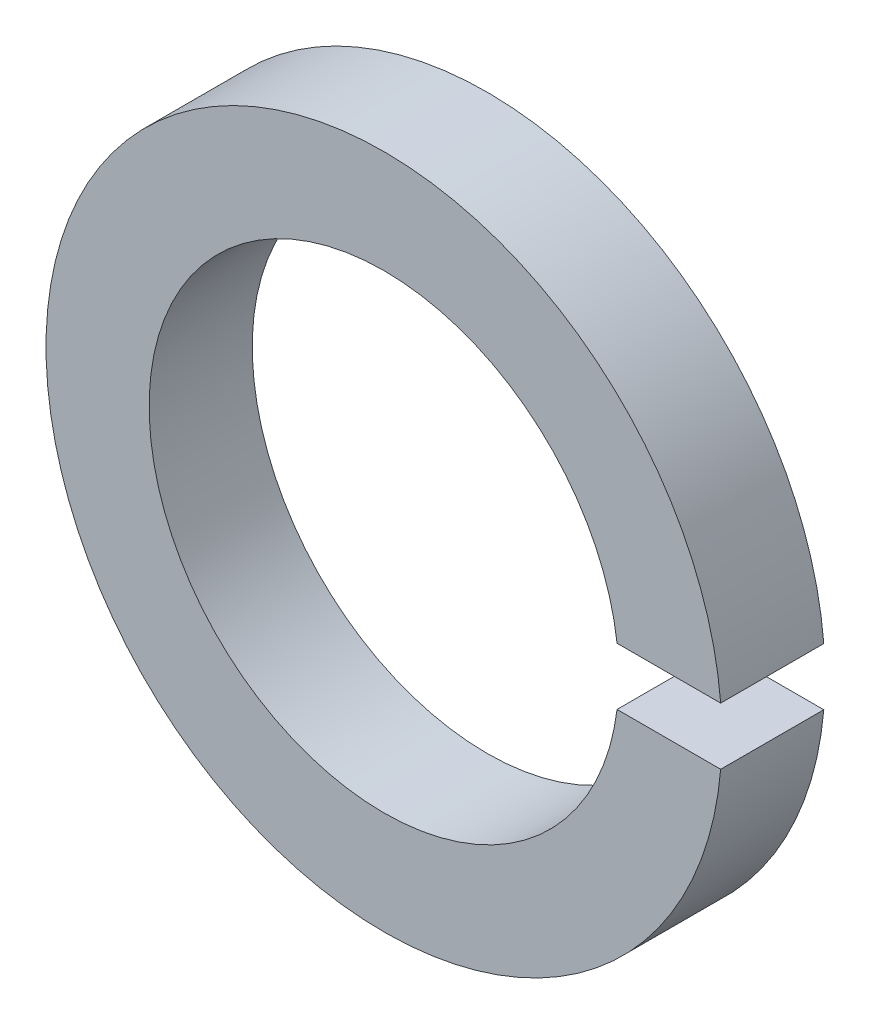
ISO-10303-21;
HEADER;
FILE_DESCRIPTION(('STEP AP214'),'2;1');
FILE_NAME('part.step','',(''),(''),'','','');
FILE_SCHEMA(('AUTOMOTIVE_DESIGN { 1 0 10303 214 1 1 1 1 }'));
ENDSEC;
DATA;
#1=APPLICATION_CONTEXT('core data for automotive mechanical design processes');
#2=APPLICATION_PROTOCOL_DEFINITION('international standard','automotive_design',2000,#1);
#3=PRODUCT_CONTEXT('',#1,'mechanical');
#4=PRODUCT('Part','Part','',(#3));
#5=PRODUCT_RELATED_PRODUCT_CATEGORY('part','',(#4));
#6=PRODUCT_DEFINITION_FORMATION('','',#4);
#7=PRODUCT_DEFINITION_CONTEXT('part definition',#1,'design');
#8=PRODUCT_DEFINITION('design','',#6,#7);
#9=PRODUCT_DEFINITION_SHAPE('','',#8);
#10=(LENGTH_UNIT() NAMED_UNIT(*) SI_UNIT(.MILLI.,.METRE.));
#11=(NAMED_UNIT(*) PLANE_ANGLE_UNIT() SI_UNIT($,.RADIAN.));
#12=(NAMED_UNIT(*) SI_UNIT($,.STERADIAN.) SOLID_ANGLE_UNIT());
#13=UNCERTAINTY_MEASURE_WITH_UNIT(LENGTH_MEASURE(1.E-05),#10,'distance_accuracy_value','');
#14=(GEOMETRIC_REPRESENTATION_CONTEXT(3) GLOBAL_UNCERTAINTY_ASSIGNED_CONTEXT((#13)) GLOBAL_UNIT_ASSIGNED_CONTEXT((#10,
#11,#12)) REPRESENTATION_CONTEXT('',''));
#15=CARTESIAN_POINT('',(0.,0.,0.));
#16=DIRECTION('',(0.,0.,1.));
#17=DIRECTION('',(1.,0.,0.));
#18=AXIS2_PLACEMENT_3D('',#15,#16,#17);
#19=CARTESIAN_POINT('',(0.,0.,4.5));
#20=DIRECTION('',(0.,0.,1.));
#21=DIRECTION('',(1.,0.,0.));
#22=AXIS2_PLACEMENT_3D('',#19,#20,#21);
#23=PLANE('',#22);
#24=DIRECTION('',(-1.,0.,0.));
#25=VECTOR('',#24,1.);
#26=CARTESIAN_POINT('',(0.,1.25,4.5));
#27=LINE('',#26,#25);
#28=CARTESIAN_POINT('',(14.6969384566991,1.25,4.5));
#29=VERTEX_POINT('',#28);
#30=CARTESIAN_POINT('',(10.1734949746879,1.25,4.5));
#31=VERTEX_POINT('',#30);
#32=EDGE_CURVE('E51',#29,#31,#27,.T.);
#33=ORIENTED_EDGE('',*,*,#32,.F.);
#34=CARTESIAN_POINT('',(0.,0.,4.5));
#35=DIRECTION('',(0.,0.,1.));
#36=DIRECTION('',(1.,0.,0.));
#37=AXIS2_PLACEMENT_3D('',#34,#35,#36);
#38=CIRCLE('',#37,14.75);
#39=CARTESIAN_POINT('',(14.6969384566991,-1.24999999999999,4.5));
#40=VERTEX_POINT('',#39);
#41=EDGE_CURVE('E74',#29,#40,#38,.T.);
#42=ORIENTED_EDGE('',*,*,#41,.T.);
#43=DIRECTION('',(1.,0.,0.));
#44=VECTOR('',#43,1.);
#45=CARTESIAN_POINT('',(0.,-1.25,4.5));
#46=LINE('',#45,#44);
#47=CARTESIAN_POINT('',(10.1734949746879,-1.24999999999999,4.5));
#48=VERTEX_POINT('',#47);
#49=EDGE_CURVE('E68',#48,#40,#46,.T.);
#50=ORIENTED_EDGE('',*,*,#49,.F.);
#51=CARTESIAN_POINT('',(0.,0.,4.5));
#52=DIRECTION('',(0.,0.,1.));
#53=DIRECTION('',(1.,0.,0.));
#54=AXIS2_PLACEMENT_3D('',#51,#52,#53);
#55=CIRCLE('',#54,10.25);
#56=EDGE_CURVE('E78',#31,#48,#55,.T.);
#57=ORIENTED_EDGE('',*,*,#56,.F.);
#58=EDGE_LOOP('',(#33,#42,#50,#57));
#59=FACE_BOUND('',#58,.T.);
#60=ADVANCED_FACE('F29',(#59),#23,.T.);
#61=CARTESIAN_POINT('',(0.,0.,0.));
#62=DIRECTION('',(0.,0.,1.));
#63=DIRECTION('',(1.,0.,0.));
#64=AXIS2_PLACEMENT_3D('',#61,#62,#63);
#65=PLANE('',#64);
#66=CARTESIAN_POINT('',(0.,0.,0.));
#67=DIRECTION('',(0.,0.,1.));
#68=DIRECTION('',(1.,0.,0.));
#69=AXIS2_PLACEMENT_3D('',#66,#67,#68);
#70=CIRCLE('',#69,14.75);
#71=CARTESIAN_POINT('',(14.6969384566991,1.25,0.));
#72=VERTEX_POINT('',#71);
#73=CARTESIAN_POINT('',(14.6969384566991,-1.24999999999999,0.));
#74=VERTEX_POINT('',#73);
#75=EDGE_CURVE('E82',#72,#74,#70,.T.);
#76=ORIENTED_EDGE('',*,*,#75,.F.);
#77=DIRECTION('',(-1.,0.,0.));
#78=VECTOR('',#77,1.);
#79=CARTESIAN_POINT('',(0.,1.25,0.));
#80=LINE('',#79,#78);
#81=CARTESIAN_POINT('',(10.1734949746879,1.25,0.));
#82=VERTEX_POINT('',#81);
#83=EDGE_CURVE('E95',#72,#82,#80,.T.);
#84=ORIENTED_EDGE('',*,*,#83,.T.);
#85=CARTESIAN_POINT('',(0.,0.,0.));
#86=DIRECTION('',(0.,0.,1.));
#87=DIRECTION('',(1.,0.,0.));
#88=AXIS2_PLACEMENT_3D('',#85,#86,#87);
#89=CIRCLE('',#88,10.25);
#90=CARTESIAN_POINT('',(10.1734949746879,-1.24999999999999,0.));
#91=VERTEX_POINT('',#90);
#92=EDGE_CURVE('E83',#82,#91,#89,.T.);
#93=ORIENTED_EDGE('',*,*,#92,.T.);
#94=DIRECTION('',(1.,0.,0.));
#95=VECTOR('',#94,1.);
#96=CARTESIAN_POINT('',(0.,-1.25,0.));
#97=LINE('',#96,#95);
#98=EDGE_CURVE('E44',#91,#74,#97,.T.);
#99=ORIENTED_EDGE('',*,*,#98,.T.);
#100=EDGE_LOOP('',(#76,#84,#93,#99));
#101=FACE_BOUND('',#100,.T.);
#102=ADVANCED_FACE('F101',(#101),#65,.F.);
#103=CARTESIAN_POINT('',(0.,0.,4.5));
#104=DIRECTION('',(0.,0.,-1.));
#105=DIRECTION('',(-1.,0.,0.));
#106=AXIS2_PLACEMENT_3D('',#103,#104,#105);
#107=CYLINDRICAL_SURFACE('',#106,14.75);
#108=ORIENTED_EDGE('',*,*,#41,.F.);
#109=DIRECTION('',(0.,0.,-1.));
#110=VECTOR('',#109,1.);
#111=CARTESIAN_POINT('',(14.6969384566991,1.25,4.5));
#112=LINE('',#111,#110);
#113=EDGE_CURVE('E87',#29,#72,#112,.T.);
#114=ORIENTED_EDGE('',*,*,#113,.T.);
#115=ORIENTED_EDGE('',*,*,#75,.T.);
#116=DIRECTION('',(0.,0.,-1.));
#117=VECTOR('',#116,1.);
#118=CARTESIAN_POINT('',(14.6969384566991,-1.24999999999999,4.5));
#119=LINE('',#118,#117);
#120=EDGE_CURVE('E93',#74,#40,#119,.F.);
#121=ORIENTED_EDGE('',*,*,#120,.T.);
#122=EDGE_LOOP('',(#108,#114,#115,#121));
#123=FACE_BOUND('',#122,.T.);
#124=ADVANCED_FACE('F31',(#123),#107,.T.);
#125=CARTESIAN_POINT('',(0.,0.,4.5));
#126=DIRECTION('',(0.,0.,-1.));
#127=DIRECTION('',(-1.,0.,0.));
#128=AXIS2_PLACEMENT_3D('',#125,#126,#127);
#129=CYLINDRICAL_SURFACE('',#128,10.25);
#130=DIRECTION('',(0.,0.,-1.));
#131=VECTOR('',#130,1.);
#132=CARTESIAN_POINT('',(10.1734949746879,1.25,4.5));
#133=LINE('',#132,#131);
#134=EDGE_CURVE('E11',#31,#82,#133,.T.);
#135=ORIENTED_EDGE('',*,*,#134,.F.);
#136=ORIENTED_EDGE('',*,*,#56,.T.);
#137=DIRECTION('',(0.,0.,-1.));
#138=VECTOR('',#137,1.);
#139=CARTESIAN_POINT('',(10.1734949746879,-1.24999999999999,4.5));
#140=LINE('',#139,#138);
#141=EDGE_CURVE('E37',#91,#48,#140,.F.);
#142=ORIENTED_EDGE('',*,*,#141,.F.);
#143=ORIENTED_EDGE('',*,*,#92,.F.);
#144=EDGE_LOOP('',(#135,#136,#142,#143));
#145=FACE_BOUND('',#144,.T.);
#146=ADVANCED_FACE('F81',(#145),#129,.F.);
#147=CARTESIAN_POINT('',(0.,-1.25,0.));
#148=DIRECTION('',(0.,-1.,0.));
#149=DIRECTION('',(1.,0.,0.));
#150=AXIS2_PLACEMENT_3D('',#147,#148,#149);
#151=PLANE('',#150);
#152=ORIENTED_EDGE('',*,*,#98,.F.);
#153=ORIENTED_EDGE('',*,*,#141,.T.);
#154=ORIENTED_EDGE('',*,*,#49,.T.);
#155=ORIENTED_EDGE('',*,*,#120,.F.);
#156=EDGE_LOOP('',(#152,#153,#154,#155));
#157=FACE_BOUND('',#156,.T.);
#158=ADVANCED_FACE('F67',(#157),#151,.F.);
#159=CARTESIAN_POINT('',(0.,1.25,0.));
#160=DIRECTION('',(0.,1.,0.));
#161=DIRECTION('',(0.,0.,1.));
#162=AXIS2_PLACEMENT_3D('',#159,#160,#161);
#163=PLANE('',#162);
#164=ORIENTED_EDGE('',*,*,#32,.T.);
#165=ORIENTED_EDGE('',*,*,#134,.T.);
#166=ORIENTED_EDGE('',*,*,#83,.F.);
#167=ORIENTED_EDGE('',*,*,#113,.F.);
#168=EDGE_LOOP('',(#164,#165,#166,#167));
#169=FACE_BOUND('',#168,.T.);
#170=ADVANCED_FACE('F103',(#169),#163,.F.);
#171=CLOSED_SHELL('',(#60,#102,#124,#146,#158,#170));
#172=MANIFOLD_SOLID_BREP('B2',#171);
#173=ADVANCED_BREP_SHAPE_REPRESENTATION('',(#18,#172),#14);
#174=SHAPE_DEFINITION_REPRESENTATION(#9,#173);
ENDSEC;
END-ISO-10303-21;
